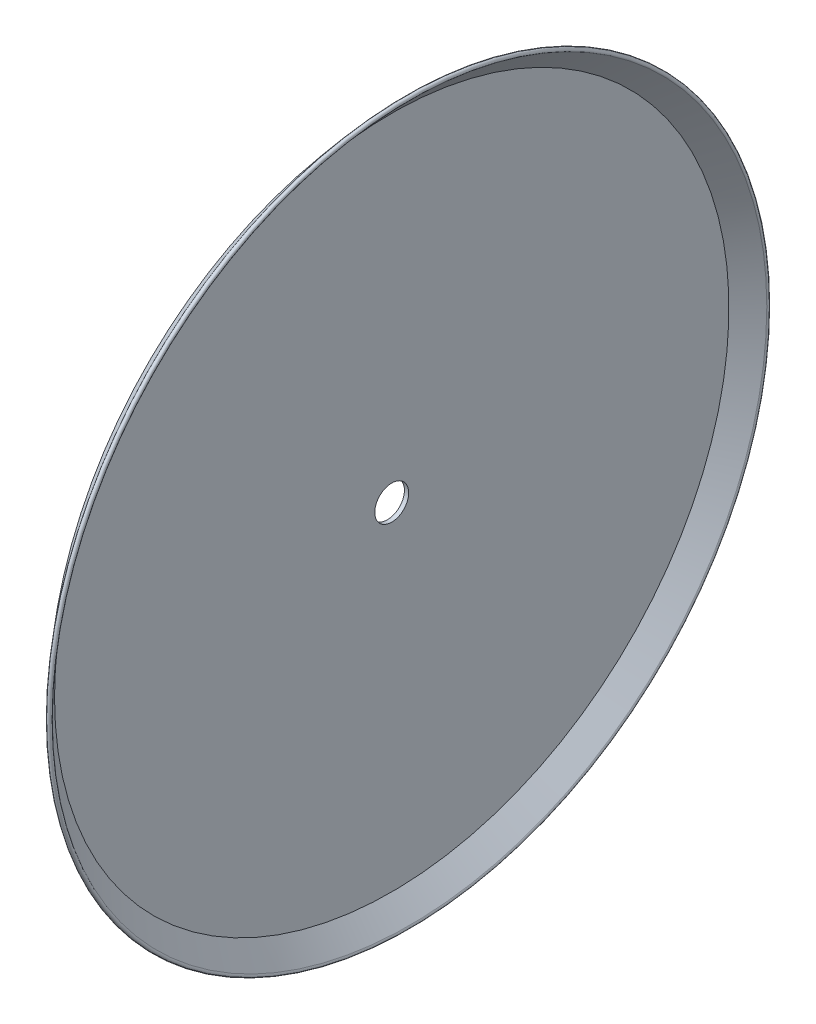
ISO-10303-21;
HEADER;
FILE_DESCRIPTION(('STEP AP214'),'2;1');
FILE_NAME('part.step','',(''),(''),'','','');
FILE_SCHEMA(('AUTOMOTIVE_DESIGN { 1 0 10303 214 1 1 1 1 }'));
ENDSEC;
DATA;
#1=APPLICATION_CONTEXT('core data for automotive mechanical design processes');
#2=APPLICATION_PROTOCOL_DEFINITION('international standard','automotive_design',2000,#1);
#3=PRODUCT_CONTEXT('',#1,'mechanical');
#4=PRODUCT('Part','Part','',(#3));
#5=PRODUCT_RELATED_PRODUCT_CATEGORY('part','',(#4));
#6=PRODUCT_DEFINITION_FORMATION('','',#4);
#7=PRODUCT_DEFINITION_CONTEXT('part definition',#1,'design');
#8=PRODUCT_DEFINITION('design','',#6,#7);
#9=PRODUCT_DEFINITION_SHAPE('','',#8);
#10=(LENGTH_UNIT() NAMED_UNIT(*) SI_UNIT(.MILLI.,.METRE.));
#11=(NAMED_UNIT(*) PLANE_ANGLE_UNIT() SI_UNIT($,.RADIAN.));
#12=(NAMED_UNIT(*) SI_UNIT($,.STERADIAN.) SOLID_ANGLE_UNIT());
#13=UNCERTAINTY_MEASURE_WITH_UNIT(LENGTH_MEASURE(1.E-05),#10,'distance_accuracy_value','');
#14=(GEOMETRIC_REPRESENTATION_CONTEXT(3) GLOBAL_UNCERTAINTY_ASSIGNED_CONTEXT((#13)) GLOBAL_UNIT_ASSIGNED_CONTEXT((#10,
#11,#12)) REPRESENTATION_CONTEXT('',''));
#15=CARTESIAN_POINT('',(0.,0.,0.));
#16=DIRECTION('',(0.,0.,1.));
#17=DIRECTION('',(1.,0.,0.));
#18=AXIS2_PLACEMENT_3D('',#15,#16,#17);
#19=CARTESIAN_POINT('',(-57.0129177332422,0.,0.));
#20=DIRECTION('',(1.,0.,0.));
#21=DIRECTION('',(0.,0.,-1.));
#22=AXIS2_PLACEMENT_3D('',#19,#20,#21);
#23=PLANE('',#22);
#24=CARTESIAN_POINT('',(-57.0129177332422,0.,0.));
#25=DIRECTION('',(1.,0.,0.));
#26=DIRECTION('',(0.,0.,-1.));
#27=AXIS2_PLACEMENT_3D('',#24,#25,#26);
#28=CIRCLE('',#27,4.);
#29=CARTESIAN_POINT('',(-57.0129177332422,0.,-4.));
#30=VERTEX_POINT('',#29);
#31=EDGE_CURVE('E60',#30,#30,#28,.T.);
#32=ORIENTED_EDGE('',*,*,#31,.T.);
#33=EDGE_LOOP('',(#32));
#34=FACE_BOUND('',#33,.T.);
#35=CARTESIAN_POINT('',(-57.0129177332422,0.,0.));
#36=DIRECTION('',(-1.,0.,0.));
#37=DIRECTION('',(0.,0.,1.));
#38=AXIS2_PLACEMENT_3D('',#35,#36,#37);
#39=CIRCLE('',#38,79.7571289623125);
#40=CARTESIAN_POINT('',(-57.0129177332422,0.,79.7571289623125));
#41=VERTEX_POINT('',#40);
#42=EDGE_CURVE('E10',#41,#41,#39,.T.);
#43=ORIENTED_EDGE('',*,*,#42,.T.);
#44=EDGE_LOOP('',(#43));
#45=FACE_BOUND('',#44,.T.);
#46=ADVANCED_FACE('F37',(#34,#45),#23,.F.);
#47=CARTESIAN_POINT('',(-52.5403008674107,0.,0.));
#48=DIRECTION('',(1.,0.,0.));
#49=DIRECTION('',(0.,0.,-1.));
#50=AXIS2_PLACEMENT_3D('',#47,#48,#49);
#51=CONICAL_SURFACE('',#50,85.,0.864513739586166);
#52=ORIENTED_EDGE('',*,*,#42,.F.);
#53=EDGE_LOOP('',(#52));
#54=FACE_BOUND('',#53,.T.);
#55=CARTESIAN_POINT('',(-52.5403008674107,0.,0.));
#56=DIRECTION('',(-1.,0.,0.));
#57=DIRECTION('',(0.,0.,1.));
#58=AXIS2_PLACEMENT_3D('',#55,#56,#57);
#59=CIRCLE('',#58,85.);
#60=CARTESIAN_POINT('',(-52.5403008674107,0.,85.));
#61=VERTEX_POINT('',#60);
#62=EDGE_CURVE('E44',#61,#61,#59,.T.);
#63=ORIENTED_EDGE('',*,*,#62,.T.);
#64=EDGE_LOOP('',(#63));
#65=FACE_BOUND('',#64,.T.);
#66=ADVANCED_FACE('F86',(#54,#65),#51,.T.);
#67=CARTESIAN_POINT('',(-52.1708360158956,0.,0.));
#68=DIRECTION('',(-1.,0.,0.));
#69=DIRECTION('',(0.,0.,1.));
#70=AXIS2_PLACEMENT_3D('',#67,#68,#69);
#71=TOROIDAL_SURFACE('',#70,84.6631087363927,0.500000000000001);
#72=ORIENTED_EDGE('',*,*,#62,.F.);
#73=EDGE_LOOP('',(#72));
#74=FACE_BOUND('',#73,.T.);
#75=CARTESIAN_POINT('',(-51.8013711643805,0.,0.));
#76=DIRECTION('',(-1.,0.,0.));
#77=DIRECTION('',(0.,0.,1.));
#78=AXIS2_PLACEMENT_3D('',#75,#76,#77);
#79=CIRCLE('',#78,84.3262174727854);
#80=CARTESIAN_POINT('',(-51.8013711643805,0.,84.3262174727854));
#81=VERTEX_POINT('',#80);
#82=EDGE_CURVE('E49',#81,#81,#79,.T.);
#83=ORIENTED_EDGE('',*,*,#82,.T.);
#84=EDGE_LOOP('',(#83));
#85=FACE_BOUND('',#84,.T.);
#86=ADVANCED_FACE('F80',(#74,#85),#71,.T.);
#87=CARTESIAN_POINT('',(-56.0129177332422,0.,0.));
#88=DIRECTION('',(1.,0.,0.));
#89=DIRECTION('',(0.,0.,-1.));
#90=AXIS2_PLACEMENT_3D('',#87,#88,#89);
#91=CONICAL_SURFACE('',#90,79.6016751050254,0.842742419216695);
#92=ORIENTED_EDGE('',*,*,#82,.F.);
#93=EDGE_LOOP('',(#92));
#94=FACE_BOUND('',#93,.T.);
#95=CARTESIAN_POINT('',(-56.0129177332422,0.,0.));
#96=DIRECTION('',(-1.,0.,0.));
#97=DIRECTION('',(0.,0.,1.));
#98=AXIS2_PLACEMENT_3D('',#95,#96,#97);
#99=CIRCLE('',#98,79.6016751050254);
#100=CARTESIAN_POINT('',(-56.0129177332422,0.,79.6016751050254));
#101=VERTEX_POINT('',#100);
#102=EDGE_CURVE('E54',#101,#101,#99,.T.);
#103=ORIENTED_EDGE('',*,*,#102,.T.);
#104=EDGE_LOOP('',(#103));
#105=FACE_BOUND('',#104,.T.);
#106=ADVANCED_FACE('F75',(#94,#105),#91,.F.);
#107=CARTESIAN_POINT('',(-56.0129177332422,0.,0.));
#108=DIRECTION('',(-1.,0.,0.));
#109=DIRECTION('',(0.,0.,1.));
#110=AXIS2_PLACEMENT_3D('',#107,#108,#109);
#111=PLANE('',#110);
#112=CARTESIAN_POINT('',(-56.0129177332422,0.,0.));
#113=DIRECTION('',(1.,0.,0.));
#114=DIRECTION('',(0.,0.,-1.));
#115=AXIS2_PLACEMENT_3D('',#112,#113,#114);
#116=CIRCLE('',#115,4.);
#117=CARTESIAN_POINT('',(-56.0129177332422,0.,-4.));
#118=VERTEX_POINT('',#117);
#119=EDGE_CURVE('E64',#118,#118,#116,.T.);
#120=ORIENTED_EDGE('',*,*,#119,.F.);
#121=EDGE_LOOP('',(#120));
#122=FACE_BOUND('',#121,.T.);
#123=ORIENTED_EDGE('',*,*,#102,.F.);
#124=EDGE_LOOP('',(#123));
#125=FACE_BOUND('',#124,.T.);
#126=ADVANCED_FACE('F72',(#122,#125),#111,.F.);
#127=CARTESIAN_POINT('',(-66.0129177332422,0.,0.));
#128=DIRECTION('',(1.,0.,0.));
#129=DIRECTION('',(0.,0.,-1.));
#130=AXIS2_PLACEMENT_3D('',#127,#128,#129);
#131=CYLINDRICAL_SURFACE('',#130,4.);
#132=ORIENTED_EDGE('',*,*,#119,.T.);
#133=EDGE_LOOP('',(#132));
#134=FACE_BOUND('',#133,.T.);
#135=ORIENTED_EDGE('',*,*,#31,.F.);
#136=EDGE_LOOP('',(#135));
#137=FACE_BOUND('',#136,.T.);
#138=ADVANCED_FACE('F69',(#134,#137),#131,.F.);
#139=CLOSED_SHELL('',(#46,#66,#86,#106,#126,#138));
#140=MANIFOLD_SOLID_BREP('B2',#139);
#141=ADVANCED_BREP_SHAPE_REPRESENTATION('',(#18,#140),#14);
#142=SHAPE_DEFINITION_REPRESENTATION(#9,#141);
ENDSEC;
END-ISO-10303-21;
